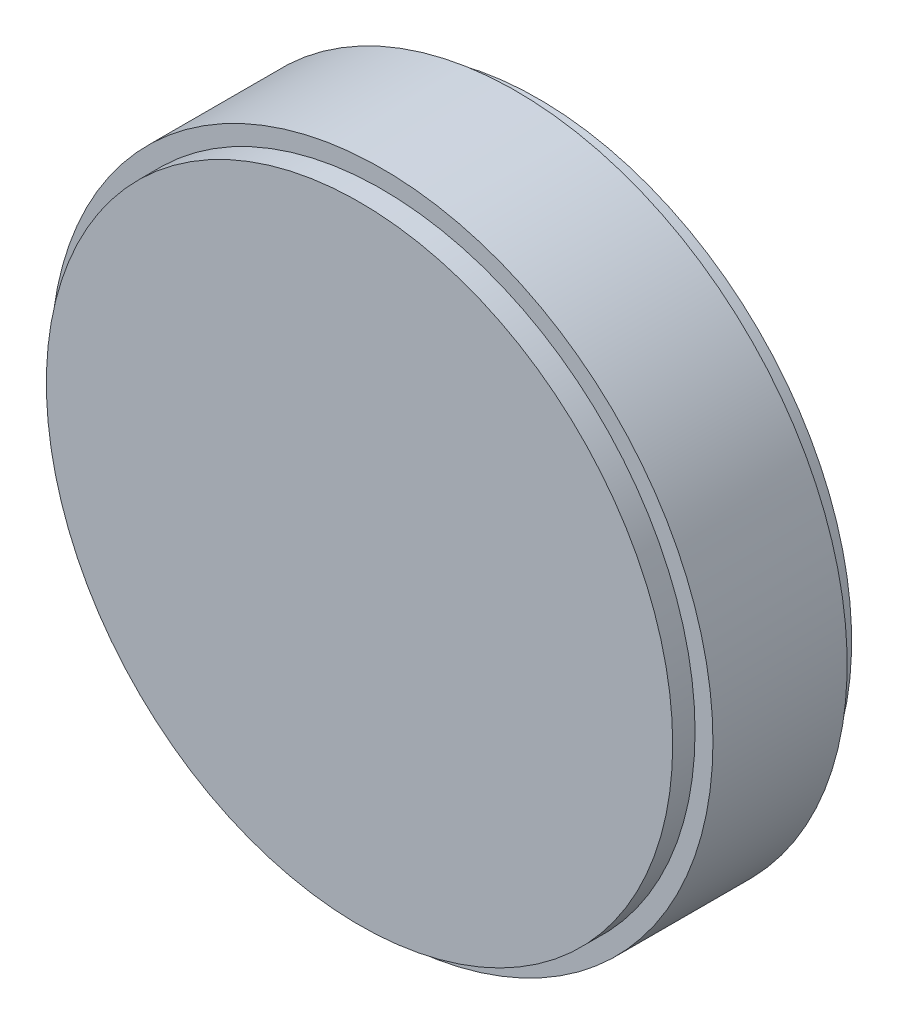
ISO-10303-21;
HEADER;
FILE_DESCRIPTION(('STEP AP214'),'2;1');
FILE_NAME('part.step','',(''),(''),'','','');
FILE_SCHEMA(('AUTOMOTIVE_DESIGN { 1 0 10303 214 1 1 1 1 }'));
ENDSEC;
DATA;
#1=APPLICATION_CONTEXT('core data for automotive mechanical design processes');
#2=APPLICATION_PROTOCOL_DEFINITION('international standard','automotive_design',2000,#1);
#3=PRODUCT_CONTEXT('',#1,'mechanical');
#4=PRODUCT('Part','Part','',(#3));
#5=PRODUCT_RELATED_PRODUCT_CATEGORY('part','',(#4));
#6=PRODUCT_DEFINITION_FORMATION('','',#4);
#7=PRODUCT_DEFINITION_CONTEXT('part definition',#1,'design');
#8=PRODUCT_DEFINITION('design','',#6,#7);
#9=PRODUCT_DEFINITION_SHAPE('','',#8);
#10=(LENGTH_UNIT() NAMED_UNIT(*) SI_UNIT(.MILLI.,.METRE.));
#11=(NAMED_UNIT(*) PLANE_ANGLE_UNIT() SI_UNIT($,.RADIAN.));
#12=(NAMED_UNIT(*) SI_UNIT($,.STERADIAN.) SOLID_ANGLE_UNIT());
#13=UNCERTAINTY_MEASURE_WITH_UNIT(LENGTH_MEASURE(1.E-05),#10,'distance_accuracy_value','');
#14=(GEOMETRIC_REPRESENTATION_CONTEXT(3) GLOBAL_UNCERTAINTY_ASSIGNED_CONTEXT((#13)) GLOBAL_UNIT_ASSIGNED_CONTEXT((#10,
#11,#12)) REPRESENTATION_CONTEXT('',''));
#15=CARTESIAN_POINT('',(0.,0.,0.));
#16=DIRECTION('',(0.,0.,1.));
#17=DIRECTION('',(1.,0.,0.));
#18=AXIS2_PLACEMENT_3D('',#15,#16,#17);
#19=CARTESIAN_POINT('',(0.,0.,20.));
#20=DIRECTION('',(0.,0.,-1.));
#21=DIRECTION('',(-1.,0.,0.));
#22=AXIS2_PLACEMENT_3D('',#19,#20,#21);
#23=CYLINDRICAL_SURFACE('',#22,74.);
#24=CARTESIAN_POINT('',(0.,0.,15.));
#25=DIRECTION('',(0.,0.,1.));
#26=DIRECTION('',(1.,0.,0.));
#27=AXIS2_PLACEMENT_3D('',#24,#25,#26);
#28=CIRCLE('',#27,74.);
#29=CARTESIAN_POINT('',(74.,0.,15.));
#30=VERTEX_POINT('',#29);
#31=EDGE_CURVE('E10',#30,#30,#28,.T.);
#32=ORIENTED_EDGE('',*,*,#31,.F.);
#33=EDGE_LOOP('',(#32));
#34=FACE_BOUND('',#33,.T.);
#35=CARTESIAN_POINT('',(0.,0.,-15.));
#36=DIRECTION('',(0.,0.,-1.));
#37=DIRECTION('',(-1.,0.,0.));
#38=AXIS2_PLACEMENT_3D('',#35,#36,#37);
#39=CIRCLE('',#38,74.);
#40=CARTESIAN_POINT('',(-74.,0.,-15.));
#41=VERTEX_POINT('',#40);
#42=EDGE_CURVE('E50',#41,#41,#39,.T.);
#43=ORIENTED_EDGE('',*,*,#42,.F.);
#44=EDGE_LOOP('',(#43));
#45=FACE_BOUND('',#44,.T.);
#46=ADVANCED_FACE('F33',(#34,#45),#23,.T.);
#47=CARTESIAN_POINT('',(0.,0.,15.));
#48=DIRECTION('',(0.,0.,1.));
#49=DIRECTION('',(1.,0.,0.));
#50=AXIS2_PLACEMENT_3D('',#47,#48,#49);
#51=CYLINDRICAL_SURFACE('',#50,70.);
#52=CARTESIAN_POINT('',(0.,0.,15.));
#53=DIRECTION('',(0.,0.,1.));
#54=DIRECTION('',(1.,0.,0.));
#55=AXIS2_PLACEMENT_3D('',#52,#53,#54);
#56=CIRCLE('',#55,70.);
#57=CARTESIAN_POINT('',(70.,0.,15.));
#58=VERTEX_POINT('',#57);
#59=EDGE_CURVE('E40',#58,#58,#56,.T.);
#60=ORIENTED_EDGE('',*,*,#59,.T.);
#61=EDGE_LOOP('',(#60));
#62=FACE_BOUND('',#61,.T.);
#63=CARTESIAN_POINT('',(0.,0.,20.));
#64=DIRECTION('',(0.,0.,1.));
#65=DIRECTION('',(1.,0.,0.));
#66=AXIS2_PLACEMENT_3D('',#63,#64,#65);
#67=CIRCLE('',#66,70.);
#68=CARTESIAN_POINT('',(70.,0.,20.));
#69=VERTEX_POINT('',#68);
#70=EDGE_CURVE('E36',#69,#69,#67,.T.);
#71=ORIENTED_EDGE('',*,*,#70,.F.);
#72=EDGE_LOOP('',(#71));
#73=FACE_BOUND('',#72,.T.);
#74=ADVANCED_FACE('F67',(#62,#73),#51,.T.);
#75=CARTESIAN_POINT('',(0.,0.,15.));
#76=DIRECTION('',(0.,0.,1.));
#77=DIRECTION('',(1.,0.,0.));
#78=AXIS2_PLACEMENT_3D('',#75,#76,#77);
#79=PLANE('',#78);
#80=ORIENTED_EDGE('',*,*,#59,.F.);
#81=EDGE_LOOP('',(#80));
#82=FACE_BOUND('',#81,.T.);
#83=ORIENTED_EDGE('',*,*,#31,.T.);
#84=EDGE_LOOP('',(#83));
#85=FACE_BOUND('',#84,.T.);
#86=ADVANCED_FACE('F72',(#82,#85),#79,.T.);
#87=CARTESIAN_POINT('',(0.,0.,20.));
#88=DIRECTION('',(0.,0.,1.));
#89=DIRECTION('',(1.,0.,0.));
#90=AXIS2_PLACEMENT_3D('',#87,#88,#89);
#91=PLANE('',#90);
#92=ORIENTED_EDGE('',*,*,#70,.T.);
#93=EDGE_LOOP('',(#92));
#94=FACE_BOUND('',#93,.T.);
#95=ADVANCED_FACE('F78',(#94),#91,.T.);
#96=CARTESIAN_POINT('',(0.,0.,-15.));
#97=DIRECTION('',(0.,0.,-1.));
#98=DIRECTION('',(-1.,0.,0.));
#99=AXIS2_PLACEMENT_3D('',#96,#97,#98);
#100=CYLINDRICAL_SURFACE('',#99,70.);
#101=CARTESIAN_POINT('',(0.,0.,-15.));
#102=DIRECTION('',(0.,0.,-1.));
#103=DIRECTION('',(-1.,0.,0.));
#104=AXIS2_PLACEMENT_3D('',#101,#102,#103);
#105=CIRCLE('',#104,70.);
#106=CARTESIAN_POINT('',(-70.,0.,-15.));
#107=VERTEX_POINT('',#106);
#108=EDGE_CURVE('E49',#107,#107,#105,.T.);
#109=ORIENTED_EDGE('',*,*,#108,.T.);
#110=EDGE_LOOP('',(#109));
#111=FACE_BOUND('',#110,.T.);
#112=CARTESIAN_POINT('',(0.,0.,-20.));
#113=DIRECTION('',(0.,0.,-1.));
#114=DIRECTION('',(-1.,0.,0.));
#115=AXIS2_PLACEMENT_3D('',#112,#113,#114);
#116=CIRCLE('',#115,70.);
#117=CARTESIAN_POINT('',(-70.,0.,-20.));
#118=VERTEX_POINT('',#117);
#119=EDGE_CURVE('E46',#118,#118,#116,.T.);
#120=ORIENTED_EDGE('',*,*,#119,.F.);
#121=EDGE_LOOP('',(#120));
#122=FACE_BOUND('',#121,.T.);
#123=ADVANCED_FACE('F56',(#111,#122),#100,.T.);
#124=CARTESIAN_POINT('',(0.,0.,-15.));
#125=DIRECTION('',(0.,0.,-1.));
#126=DIRECTION('',(-1.,0.,0.));
#127=AXIS2_PLACEMENT_3D('',#124,#125,#126);
#128=PLANE('',#127);
#129=ORIENTED_EDGE('',*,*,#108,.F.);
#130=EDGE_LOOP('',(#129));
#131=FACE_BOUND('',#130,.T.);
#132=ORIENTED_EDGE('',*,*,#42,.T.);
#133=EDGE_LOOP('',(#132));
#134=FACE_BOUND('',#133,.T.);
#135=ADVANCED_FACE('F59',(#131,#134),#128,.T.);
#136=CARTESIAN_POINT('',(0.,0.,-20.));
#137=DIRECTION('',(0.,0.,1.));
#138=DIRECTION('',(1.,0.,0.));
#139=AXIS2_PLACEMENT_3D('',#136,#137,#138);
#140=PLANE('',#139);
#141=ORIENTED_EDGE('',*,*,#119,.T.);
#142=EDGE_LOOP('',(#141));
#143=FACE_BOUND('',#142,.T.);
#144=ADVANCED_FACE('F62',(#143),#140,.F.);
#145=CLOSED_SHELL('',(#46,#74,#86,#95,#123,#135,#144));
#146=MANIFOLD_SOLID_BREP('B2',#145);
#147=ADVANCED_BREP_SHAPE_REPRESENTATION('',(#18,#146),#14);
#148=SHAPE_DEFINITION_REPRESENTATION(#9,#147);
ENDSEC;
END-ISO-10303-21;
